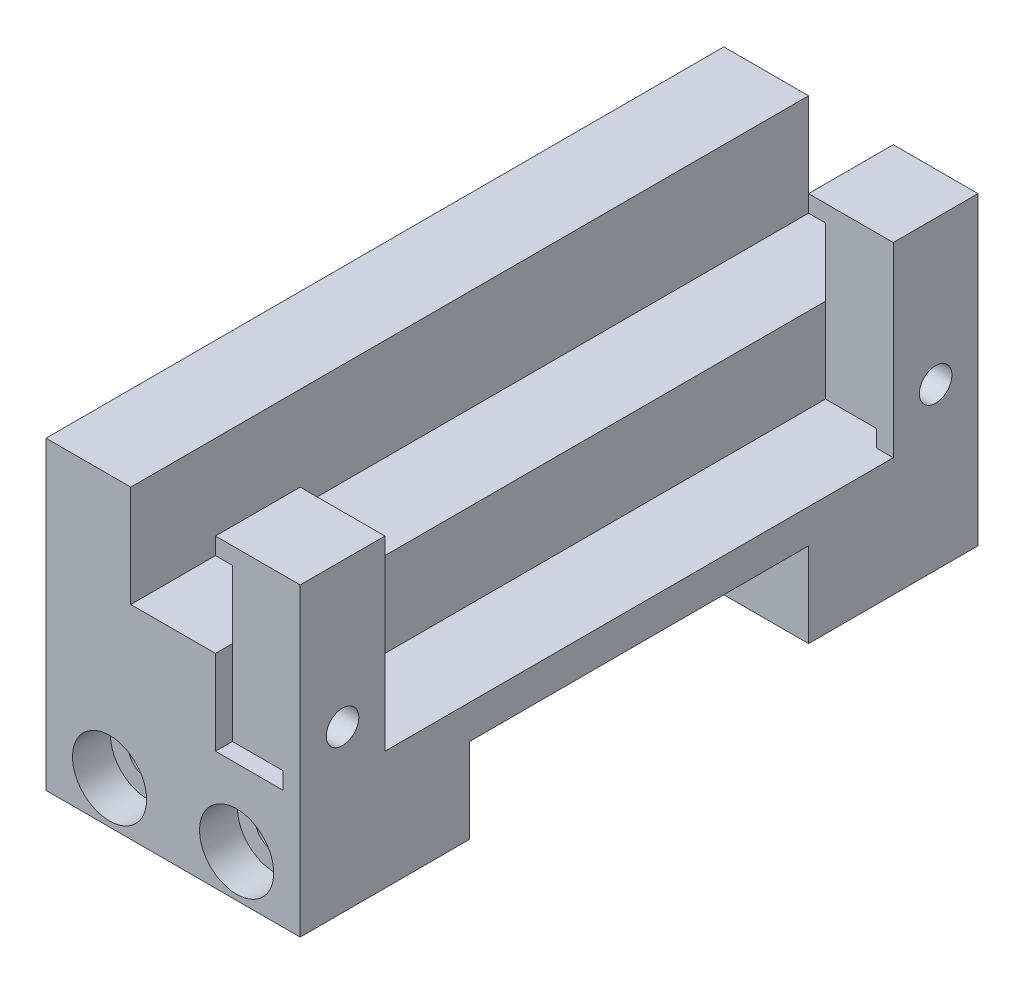
ISO-10303-21;
HEADER;
FILE_DESCRIPTION(('STEP AP214'),'2;1');
FILE_NAME('part.step','',(''),(''),'','','');
FILE_SCHEMA(('AUTOMOTIVE_DESIGN { 1 0 10303 214 1 1 1 1 }'));
ENDSEC;
DATA;
#1=APPLICATION_CONTEXT('core data for automotive mechanical design processes');
#2=APPLICATION_PROTOCOL_DEFINITION('international standard','automotive_design',2000,#1);
#3=PRODUCT_CONTEXT('',#1,'mechanical');
#4=PRODUCT('Part','Part','',(#3));
#5=PRODUCT_RELATED_PRODUCT_CATEGORY('part','',(#4));
#6=PRODUCT_DEFINITION_FORMATION('','',#4);
#7=PRODUCT_DEFINITION_CONTEXT('part definition',#1,'design');
#8=PRODUCT_DEFINITION('design','',#6,#7);
#9=PRODUCT_DEFINITION_SHAPE('','',#8);
#10=(LENGTH_UNIT() NAMED_UNIT(*) SI_UNIT(.MILLI.,.METRE.));
#11=(NAMED_UNIT(*) PLANE_ANGLE_UNIT() SI_UNIT($,.RADIAN.));
#12=(NAMED_UNIT(*) SI_UNIT($,.STERADIAN.) SOLID_ANGLE_UNIT());
#13=UNCERTAINTY_MEASURE_WITH_UNIT(LENGTH_MEASURE(1.E-05),#10,'distance_accuracy_value','');
#14=(GEOMETRIC_REPRESENTATION_CONTEXT(3) GLOBAL_UNCERTAINTY_ASSIGNED_CONTEXT((#13)) GLOBAL_UNIT_ASSIGNED_CONTEXT((#10,
#11,#12)) REPRESENTATION_CONTEXT('',''));
#15=CARTESIAN_POINT('',(0.,0.,0.));
#16=DIRECTION('',(0.,0.,1.));
#17=DIRECTION('',(1.,0.,0.));
#18=AXIS2_PLACEMENT_3D('',#15,#16,#17);
#19=CARTESIAN_POINT('',(9.525,-9.525,25.4));
#20=DIRECTION('',(-1.,0.,0.));
#21=DIRECTION('',(0.,0.,1.));
#22=AXIS2_PLACEMENT_3D('',#19,#20,#21);
#23=PLANE('',#22);
#24=CARTESIAN_POINT('',(9.525,-3.81,22.225));
#25=DIRECTION('',(1.,0.,0.));
#26=DIRECTION('',(0.,0.,-1.));
#27=AXIS2_PLACEMENT_3D('',#24,#25,#26);
#28=CIRCLE('',#27,1.2192);
#29=CARTESIAN_POINT('',(9.525,-3.81,21.0058));
#30=VERTEX_POINT('',#29);
#31=EDGE_CURVE('E495',#30,#30,#28,.T.);
#32=ORIENTED_EDGE('',*,*,#31,.F.);
#33=EDGE_LOOP('',(#32));
#34=FACE_BOUND('',#33,.T.);
#35=DIRECTION('',(0.,0.,1.));
#36=VECTOR('',#35,1.);
#37=CARTESIAN_POINT('',(9.525,6.985,-25.4));
#38=LINE('',#37,#36);
#39=CARTESIAN_POINT('',(9.525,6.985,-25.4));
#40=VERTEX_POINT('',#39);
#41=CARTESIAN_POINT('',(9.525,6.985,-19.05));
#42=VERTEX_POINT('',#41);
#43=EDGE_CURVE('E380',#40,#42,#38,.T.);
#44=ORIENTED_EDGE('',*,*,#43,.T.);
#45=DIRECTION('',(0.,1.,0.));
#46=VECTOR('',#45,1.);
#47=CARTESIAN_POINT('',(9.525,6.985,-19.05));
#48=LINE('',#47,#46);
#49=CARTESIAN_POINT('',(9.525,-6.985,-19.05));
#50=VERTEX_POINT('',#49);
#51=EDGE_CURVE('E254',#50,#42,#48,.T.);
#52=ORIENTED_EDGE('',*,*,#51,.F.);
#53=DIRECTION('',(0.,0.,-1.));
#54=VECTOR('',#53,1.);
#55=CARTESIAN_POINT('',(9.525,-6.985,19.05));
#56=LINE('',#55,#54);
#57=CARTESIAN_POINT('',(9.525,-6.985,19.05));
#58=VERTEX_POINT('',#57);
#59=EDGE_CURVE('E257',#58,#50,#56,.T.);
#60=ORIENTED_EDGE('',*,*,#59,.F.);
#61=DIRECTION('',(0.,-1.,0.));
#62=VECTOR('',#61,1.);
#63=CARTESIAN_POINT('',(9.525,6.985,19.05));
#64=LINE('',#63,#62);
#65=CARTESIAN_POINT('',(9.525,6.985,19.05));
#66=VERTEX_POINT('',#65);
#67=EDGE_CURVE('E251',#66,#58,#64,.T.);
#68=ORIENTED_EDGE('',*,*,#67,.F.);
#69=CARTESIAN_POINT('',(9.525,6.985,25.4));
#70=VERTEX_POINT('',#69);
#71=EDGE_CURVE('E383',#66,#70,#38,.T.);
#72=ORIENTED_EDGE('',*,*,#71,.T.);
#73=DIRECTION('',(0.,1.,0.));
#74=VECTOR('',#73,1.);
#75=CARTESIAN_POINT('',(9.525,-9.525,25.4));
#76=LINE('',#75,#74);
#77=CARTESIAN_POINT('',(9.525,-15.875,25.4));
#78=VERTEX_POINT('',#77);
#79=EDGE_CURVE('E395',#78,#70,#76,.T.);
#80=ORIENTED_EDGE('',*,*,#79,.F.);
#81=DIRECTION('',(0.,0.,1.));
#82=VECTOR('',#81,1.);
#83=CARTESIAN_POINT('',(9.525,-15.875,12.7));
#84=LINE('',#83,#82);
#85=CARTESIAN_POINT('',(9.525,-15.875,12.7));
#86=VERTEX_POINT('',#85);
#87=EDGE_CURVE('E248',#86,#78,#84,.T.);
#88=ORIENTED_EDGE('',*,*,#87,.F.);
#89=DIRECTION('',(0.,1.,0.));
#90=VECTOR('',#89,1.);
#91=CARTESIAN_POINT('',(9.525,-9.525,12.7));
#92=LINE('',#91,#90);
#93=CARTESIAN_POINT('',(9.525,-9.525,12.7));
#94=VERTEX_POINT('',#93);
#95=EDGE_CURVE('E241',#86,#94,#92,.T.);
#96=ORIENTED_EDGE('',*,*,#95,.T.);
#97=DIRECTION('',(0.,0.,-1.));
#98=VECTOR('',#97,1.);
#99=CARTESIAN_POINT('',(9.525,-9.525,25.4));
#100=LINE('',#99,#98);
#101=CARTESIAN_POINT('',(9.525,-9.525,-12.7));
#102=VERTEX_POINT('',#101);
#103=EDGE_CURVE('E41',#94,#102,#100,.T.);
#104=ORIENTED_EDGE('',*,*,#103,.T.);
#105=DIRECTION('',(0.,1.,0.));
#106=VECTOR('',#105,1.);
#107=CARTESIAN_POINT('',(9.525,-9.525,-12.7));
#108=LINE('',#107,#106);
#109=CARTESIAN_POINT('',(9.525,-15.875,-12.7));
#110=VERTEX_POINT('',#109);
#111=EDGE_CURVE('E208',#110,#102,#108,.T.);
#112=ORIENTED_EDGE('',*,*,#111,.F.);
#113=DIRECTION('',(0.,0.,-1.));
#114=VECTOR('',#113,1.);
#115=CARTESIAN_POINT('',(9.525,-15.875,-12.7));
#116=LINE('',#115,#114);
#117=CARTESIAN_POINT('',(9.525,-15.875,-25.4));
#118=VERTEX_POINT('',#117);
#119=EDGE_CURVE('E214',#110,#118,#116,.T.);
#120=ORIENTED_EDGE('',*,*,#119,.T.);
#121=DIRECTION('',(0.,1.,0.));
#122=VECTOR('',#121,1.);
#123=CARTESIAN_POINT('',(9.525,-9.525,-25.4));
#124=LINE('',#123,#122);
#125=EDGE_CURVE('E382',#118,#40,#124,.T.);
#126=ORIENTED_EDGE('',*,*,#125,.T.);
#127=EDGE_LOOP('',(#44,#52,#60,#68,#72,#80,#88,#96,#104,#112,#120,#126));
#128=FACE_BOUND('',#127,.T.);
#129=CARTESIAN_POINT('',(9.525,-3.81,-22.225));
#130=DIRECTION('',(1.,0.,0.));
#131=DIRECTION('',(0.,0.,-1.));
#132=AXIS2_PLACEMENT_3D('',#129,#130,#131);
#133=CIRCLE('',#132,1.2192);
#134=CARTESIAN_POINT('',(9.525,-3.81,-23.4442));
#135=VERTEX_POINT('',#134);
#136=EDGE_CURVE('E489',#135,#135,#133,.T.);
#137=ORIENTED_EDGE('',*,*,#136,.F.);
#138=EDGE_LOOP('',(#137));
#139=FACE_BOUND('',#138,.T.);
#140=ADVANCED_FACE('F34',(#34,#128,#139),#23,.F.);
#141=CARTESIAN_POINT('',(-9.525,-9.525,25.4));
#142=DIRECTION('',(0.,1.,0.));
#143=DIRECTION('',(0.,0.,1.));
#144=AXIS2_PLACEMENT_3D('',#141,#142,#143);
#145=PLANE('',#144);
#146=DIRECTION('',(-1.,0.,0.));
#147=VECTOR('',#146,1.);
#148=CARTESIAN_POINT('',(-9.525,-9.525,-12.7));
#149=LINE('',#148,#147);
#150=CARTESIAN_POINT('',(-9.525,-9.525,-12.7));
#151=VERTEX_POINT('',#150);
#152=EDGE_CURVE('E50',#102,#151,#149,.T.);
#153=ORIENTED_EDGE('',*,*,#152,.F.);
#154=ORIENTED_EDGE('',*,*,#103,.F.);
#155=DIRECTION('',(-1.,0.,0.));
#156=VECTOR('',#155,1.);
#157=CARTESIAN_POINT('',(-9.525,-9.525,12.7));
#158=LINE('',#157,#156);
#159=CARTESIAN_POINT('',(-9.525,-9.525,12.7));
#160=VERTEX_POINT('',#159);
#161=EDGE_CURVE('E243',#94,#160,#158,.T.);
#162=ORIENTED_EDGE('',*,*,#161,.T.);
#163=DIRECTION('',(0.,0.,-1.));
#164=VECTOR('',#163,1.);
#165=CARTESIAN_POINT('',(-9.525,-9.525,25.4));
#166=LINE('',#165,#164);
#167=EDGE_CURVE('E11',#160,#151,#166,.T.);
#168=ORIENTED_EDGE('',*,*,#167,.T.);
#169=EDGE_LOOP('',(#153,#154,#162,#168));
#170=FACE_BOUND('',#169,.T.);
#171=ADVANCED_FACE('F556',(#170),#145,.F.);
#172=CARTESIAN_POINT('',(3.175,0.,-25.4));
#173=DIRECTION('',(-1.,0.,0.));
#174=DIRECTION('',(0.,0.,1.));
#175=AXIS2_PLACEMENT_3D('',#172,#173,#174);
#176=PLANE('',#175);
#177=DIRECTION('',(0.,1.,0.));
#178=VECTOR('',#177,1.);
#179=CARTESIAN_POINT('',(3.175,6.985,-19.05));
#180=LINE('',#179,#178);
#181=CARTESIAN_POINT('',(3.175,5.715,-19.05));
#182=VERTEX_POINT('',#181);
#183=CARTESIAN_POINT('',(3.175,6.985,-19.05));
#184=VERTEX_POINT('',#183);
#185=EDGE_CURVE('E267',#182,#184,#180,.T.);
#186=ORIENTED_EDGE('',*,*,#185,.T.);
#187=DIRECTION('',(0.,0.,1.));
#188=VECTOR('',#187,1.);
#189=CARTESIAN_POINT('',(3.175,6.985,-25.4));
#190=LINE('',#189,#188);
#191=CARTESIAN_POINT('',(3.175,6.985,-25.4));
#192=VERTEX_POINT('',#191);
#193=EDGE_CURVE('E384',#192,#184,#190,.T.);
#194=ORIENTED_EDGE('',*,*,#193,.F.);
#195=DIRECTION('',(0.,-1.,0.));
#196=VECTOR('',#195,1.);
#197=CARTESIAN_POINT('',(3.175,0.,-25.4));
#198=LINE('',#197,#196);
#199=CARTESIAN_POINT('',(3.175,5.715,-25.4));
#200=VERTEX_POINT('',#199);
#201=EDGE_CURVE('E360',#192,#200,#198,.T.);
#202=ORIENTED_EDGE('',*,*,#201,.T.);
#203=DIRECTION('',(0.,0.,1.));
#204=VECTOR('',#203,1.);
#205=CARTESIAN_POINT('',(3.175,5.715,-25.4));
#206=LINE('',#205,#204);
#207=EDGE_CURVE('E328',#200,#182,#206,.T.);
#208=ORIENTED_EDGE('',*,*,#207,.T.);
#209=EDGE_LOOP('',(#186,#194,#202,#208));
#210=FACE_BOUND('',#209,.T.);
#211=ADVANCED_FACE('F419',(#210),#176,.T.);
#212=CARTESIAN_POINT('',(0.,6.985,-25.4));
#213=DIRECTION('',(0.,-1.,0.));
#214=DIRECTION('',(0.,0.,-1.));
#215=AXIS2_PLACEMENT_3D('',#212,#213,#214);
#216=PLANE('',#215);
#217=ORIENTED_EDGE('',*,*,#193,.T.);
#218=DIRECTION('',(1.,0.,0.));
#219=VECTOR('',#218,1.);
#220=CARTESIAN_POINT('',(-37.405425084023,6.985,-19.05));
#221=LINE('',#220,#219);
#222=EDGE_CURVE('E270',#184,#42,#221,.T.);
#223=ORIENTED_EDGE('',*,*,#222,.T.);
#224=ORIENTED_EDGE('',*,*,#43,.F.);
#225=DIRECTION('',(1.,0.,0.));
#226=VECTOR('',#225,1.);
#227=CARTESIAN_POINT('',(0.,6.985,-25.4));
#228=LINE('',#227,#226);
#229=EDGE_CURVE('E363',#192,#40,#228,.T.);
#230=ORIENTED_EDGE('',*,*,#229,.F.);
#231=EDGE_LOOP('',(#217,#223,#224,#230));
#232=FACE_BOUND('',#231,.T.);
#233=ADVANCED_FACE('F414',(#232),#216,.F.);
#234=CARTESIAN_POINT('',(0.,5.715,-25.4));
#235=DIRECTION('',(0.,-1.,0.));
#236=DIRECTION('',(0.,0.,-1.));
#237=AXIS2_PLACEMENT_3D('',#234,#235,#236);
#238=PLANE('',#237);
#239=DIRECTION('',(1.,0.,0.));
#240=VECTOR('',#239,1.);
#241=CARTESIAN_POINT('',(0.,5.715,-19.05));
#242=LINE('',#241,#240);
#243=CARTESIAN_POINT('',(4.445,5.715,-19.05));
#244=VERTEX_POINT('',#243);
#245=EDGE_CURVE('E292',#182,#244,#242,.T.);
#246=ORIENTED_EDGE('',*,*,#245,.F.);
#247=ORIENTED_EDGE('',*,*,#207,.F.);
#248=DIRECTION('',(1.,0.,0.));
#249=VECTOR('',#248,1.);
#250=CARTESIAN_POINT('',(0.,5.715,-25.4));
#251=LINE('',#250,#249);
#252=CARTESIAN_POINT('',(4.445,5.715,-25.4));
#253=VERTEX_POINT('',#252);
#254=EDGE_CURVE('E309',#200,#253,#251,.T.);
#255=ORIENTED_EDGE('',*,*,#254,.T.);
#256=DIRECTION('',(0.,0.,1.));
#257=VECTOR('',#256,1.);
#258=CARTESIAN_POINT('',(4.445,5.715,-25.4));
#259=LINE('',#258,#257);
#260=EDGE_CURVE('E333',#253,#244,#259,.T.);
#261=ORIENTED_EDGE('',*,*,#260,.T.);
#262=EDGE_LOOP('',(#246,#247,#255,#261));
#263=FACE_BOUND('',#262,.T.);
#264=ADVANCED_FACE('F422',(#263),#238,.T.);
#265=CARTESIAN_POINT('',(4.445,0.,-25.4));
#266=DIRECTION('',(-1.,0.,0.));
#267=DIRECTION('',(0.,-1.,0.));
#268=AXIS2_PLACEMENT_3D('',#265,#266,#267);
#269=PLANE('',#268);
#270=CARTESIAN_POINT('',(4.445,-3.81,-22.225));
#271=DIRECTION('',(-1.,0.,0.));
#272=DIRECTION('',(0.,-1.,0.));
#273=AXIS2_PLACEMENT_3D('',#270,#271,#272);
#274=CIRCLE('',#273,1.2192);
#275=CARTESIAN_POINT('',(4.445,-5.0292,-22.225));
#276=VERTEX_POINT('',#275);
#277=EDGE_CURVE('E486',#276,#276,#274,.T.);
#278=ORIENTED_EDGE('',*,*,#277,.F.);
#279=EDGE_LOOP('',(#278));
#280=FACE_BOUND('',#279,.T.);
#281=DIRECTION('',(0.,-1.,0.));
#282=VECTOR('',#281,1.);
#283=CARTESIAN_POINT('',(4.445,0.,-19.05));
#284=LINE('',#283,#282);
#285=CARTESIAN_POINT('',(4.445,-5.715,-19.05));
#286=VERTEX_POINT('',#285);
#287=EDGE_CURVE('E290',#244,#286,#284,.T.);
#288=ORIENTED_EDGE('',*,*,#287,.F.);
#289=ORIENTED_EDGE('',*,*,#260,.F.);
#290=DIRECTION('',(0.,-1.,0.));
#291=VECTOR('',#290,1.);
#292=CARTESIAN_POINT('',(4.445,0.,-25.4));
#293=LINE('',#292,#291);
#294=CARTESIAN_POINT('',(4.445,-5.715,-25.4));
#295=VERTEX_POINT('',#294);
#296=EDGE_CURVE('E307',#253,#295,#293,.T.);
#297=ORIENTED_EDGE('',*,*,#296,.T.);
#298=DIRECTION('',(0.,0.,1.));
#299=VECTOR('',#298,1.);
#300=CARTESIAN_POINT('',(4.445,-5.715,-25.4));
#301=LINE('',#300,#299);
#302=EDGE_CURVE('E337',#295,#286,#301,.T.);
#303=ORIENTED_EDGE('',*,*,#302,.T.);
#304=EDGE_LOOP('',(#288,#289,#297,#303));
#305=FACE_BOUND('',#304,.T.);
#306=ADVANCED_FACE('F429',(#280,#305),#269,.T.);
#307=CARTESIAN_POINT('',(0.,-5.715,-25.4));
#308=DIRECTION('',(0.,-1.,0.));
#309=DIRECTION('',(0.,0.,-1.));
#310=AXIS2_PLACEMENT_3D('',#307,#308,#309);
#311=PLANE('',#310);
#312=DIRECTION('',(1.,0.,0.));
#313=VECTOR('',#312,1.);
#314=CARTESIAN_POINT('',(0.,-5.715,-19.05));
#315=LINE('',#314,#313);
#316=CARTESIAN_POINT('',(8.255,-5.715,-19.05));
#317=VERTEX_POINT('',#316);
#318=EDGE_CURVE('E288',#286,#317,#315,.T.);
#319=ORIENTED_EDGE('',*,*,#318,.F.);
#320=ORIENTED_EDGE('',*,*,#302,.F.);
#321=DIRECTION('',(1.,0.,0.));
#322=VECTOR('',#321,1.);
#323=CARTESIAN_POINT('',(0.,-5.715,-25.4));
#324=LINE('',#323,#322);
#325=CARTESIAN_POINT('',(8.255,-5.715,-25.4));
#326=VERTEX_POINT('',#325);
#327=EDGE_CURVE('E305',#295,#326,#324,.T.);
#328=ORIENTED_EDGE('',*,*,#327,.T.);
#329=DIRECTION('',(0.,0.,1.));
#330=VECTOR('',#329,1.);
#331=CARTESIAN_POINT('',(8.255,-5.715,-25.4));
#332=LINE('',#331,#330);
#333=EDGE_CURVE('E341',#326,#317,#332,.T.);
#334=ORIENTED_EDGE('',*,*,#333,.T.);
#335=EDGE_LOOP('',(#319,#320,#328,#334));
#336=FACE_BOUND('',#335,.T.);
#337=ADVANCED_FACE('F432',(#336),#311,.T.);
#338=CARTESIAN_POINT('',(8.255,0.,-25.4));
#339=DIRECTION('',(1.,0.,0.));
#340=DIRECTION('',(0.,0.,-1.));
#341=AXIS2_PLACEMENT_3D('',#338,#339,#340);
#342=PLANE('',#341);
#343=DIRECTION('',(0.,0.,1.));
#344=VECTOR('',#343,1.);
#345=CARTESIAN_POINT('',(8.255,-6.985,-25.4));
#346=LINE('',#345,#344);
#347=CARTESIAN_POINT('',(8.255,-6.985,-25.4));
#348=VERTEX_POINT('',#347);
#349=CARTESIAN_POINT('',(8.255,-6.985,-19.05));
#350=VERTEX_POINT('',#349);
#351=EDGE_CURVE('E345',#348,#350,#346,.T.);
#352=ORIENTED_EDGE('',*,*,#351,.T.);
#353=DIRECTION('',(0.,1.,0.));
#354=VECTOR('',#353,1.);
#355=CARTESIAN_POINT('',(8.255,0.,-19.05));
#356=LINE('',#355,#354);
#357=EDGE_CURVE('E285',#350,#317,#356,.T.);
#358=ORIENTED_EDGE('',*,*,#357,.T.);
#359=ORIENTED_EDGE('',*,*,#333,.F.);
#360=DIRECTION('',(0.,1.,0.));
#361=VECTOR('',#360,1.);
#362=CARTESIAN_POINT('',(8.255,0.,-25.4));
#363=LINE('',#362,#361);
#364=EDGE_CURVE('E302',#348,#326,#363,.T.);
#365=ORIENTED_EDGE('',*,*,#364,.F.);
#366=EDGE_LOOP('',(#352,#358,#359,#365));
#367=FACE_BOUND('',#366,.T.);
#368=ADVANCED_FACE('F436',(#367),#342,.F.);
#369=DIRECTION('',(0.,-1.,0.));
#370=VECTOR('',#369,1.);
#371=CARTESIAN_POINT('',(3.175,6.985,19.05));
#372=LINE('',#371,#370);
#373=CARTESIAN_POINT('',(3.175,6.985,19.05));
#374=VERTEX_POINT('',#373);
#375=CARTESIAN_POINT('',(3.175,5.715,19.05));
#376=VERTEX_POINT('',#375);
#377=EDGE_CURVE('E262',#374,#376,#372,.T.);
#378=ORIENTED_EDGE('',*,*,#377,.T.);
#379=CARTESIAN_POINT('',(3.175,5.715,25.4));
#380=VERTEX_POINT('',#379);
#381=EDGE_CURVE('E332',#376,#380,#206,.T.);
#382=ORIENTED_EDGE('',*,*,#381,.T.);
#383=DIRECTION('',(0.,-1.,0.));
#384=VECTOR('',#383,1.);
#385=CARTESIAN_POINT('',(3.175,0.,25.4));
#386=LINE('',#385,#384);
#387=CARTESIAN_POINT('',(3.175,6.985,25.4));
#388=VERTEX_POINT('',#387);
#389=EDGE_CURVE('E375',#388,#380,#386,.T.);
#390=ORIENTED_EDGE('',*,*,#389,.F.);
#391=EDGE_CURVE('E387',#374,#388,#190,.T.);
#392=ORIENTED_EDGE('',*,*,#391,.F.);
#393=EDGE_LOOP('',(#378,#382,#390,#392));
#394=FACE_BOUND('',#393,.T.);
#395=ADVANCED_FACE('F544',(#394),#176,.T.);
#396=CARTESIAN_POINT('',(-9.525,-9.525,25.4));
#397=DIRECTION('',(1.,0.,0.));
#398=DIRECTION('',(0.,0.,-1.));
#399=AXIS2_PLACEMENT_3D('',#396,#397,#398);
#400=PLANE('',#399);
#401=CARTESIAN_POINT('',(-9.525,-3.81,22.225));
#402=DIRECTION('',(1.,0.,0.));
#403=DIRECTION('',(0.,0.,-1.));
#404=AXIS2_PLACEMENT_3D('',#401,#402,#403);
#405=CIRCLE('',#404,0.888999999999998);
#406=CARTESIAN_POINT('',(-9.525,-3.81,21.336));
#407=VERTEX_POINT('',#406);
#408=EDGE_CURVE('E504',#407,#407,#405,.T.);
#409=ORIENTED_EDGE('',*,*,#408,.T.);
#410=EDGE_LOOP('',(#409));
#411=FACE_BOUND('',#410,.T.);
#412=CARTESIAN_POINT('',(-9.525,-3.81,-22.225));
#413=DIRECTION('',(1.,0.,0.));
#414=DIRECTION('',(0.,0.,-1.));
#415=AXIS2_PLACEMENT_3D('',#412,#413,#414);
#416=CIRCLE('',#415,0.888999999999998);
#417=CARTESIAN_POINT('',(-9.525,-3.81,-23.114));
#418=VERTEX_POINT('',#417);
#419=EDGE_CURVE('E498',#418,#418,#416,.T.);
#420=ORIENTED_EDGE('',*,*,#419,.T.);
#421=EDGE_LOOP('',(#420));
#422=FACE_BOUND('',#421,.T.);
#423=DIRECTION('',(0.,-1.,0.));
#424=VECTOR('',#423,1.);
#425=CARTESIAN_POINT('',(-9.525,-9.525,25.4));
#426=LINE('',#425,#424);
#427=CARTESIAN_POINT('',(-9.525,6.985,25.4));
#428=VERTEX_POINT('',#427);
#429=CARTESIAN_POINT('',(-9.525,-15.875,25.4));
#430=VERTEX_POINT('',#429);
#431=EDGE_CURVE('E398',#428,#430,#426,.T.);
#432=ORIENTED_EDGE('',*,*,#431,.F.);
#433=DIRECTION('',(0.,0.,1.));
#434=VECTOR('',#433,1.);
#435=CARTESIAN_POINT('',(-9.525,6.985,-25.4));
#436=LINE('',#435,#434);
#437=CARTESIAN_POINT('',(-9.525,6.985,-25.4));
#438=VERTEX_POINT('',#437);
#439=EDGE_CURVE('E366',#438,#428,#436,.T.);
#440=ORIENTED_EDGE('',*,*,#439,.F.);
#441=DIRECTION('',(0.,-1.,0.));
#442=VECTOR('',#441,1.);
#443=CARTESIAN_POINT('',(-9.525,-9.525,-25.4));
#444=LINE('',#443,#442);
#445=CARTESIAN_POINT('',(-9.525,-15.875,-25.4));
#446=VERTEX_POINT('',#445);
#447=EDGE_CURVE('E399',#438,#446,#444,.T.);
#448=ORIENTED_EDGE('',*,*,#447,.T.);
#449=DIRECTION('',(0.,0.,-1.));
#450=VECTOR('',#449,1.);
#451=CARTESIAN_POINT('',(-9.525,-15.875,-12.7));
#452=LINE('',#451,#450);
#453=CARTESIAN_POINT('',(-9.525,-15.875,-12.7));
#454=VERTEX_POINT('',#453);
#455=EDGE_CURVE('E223',#454,#446,#452,.T.);
#456=ORIENTED_EDGE('',*,*,#455,.F.);
#457=DIRECTION('',(0.,-1.,0.));
#458=VECTOR('',#457,1.);
#459=CARTESIAN_POINT('',(-9.525,-9.525,-12.7));
#460=LINE('',#459,#458);
#461=EDGE_CURVE('E210',#151,#454,#460,.T.);
#462=ORIENTED_EDGE('',*,*,#461,.F.);
#463=ORIENTED_EDGE('',*,*,#167,.F.);
#464=DIRECTION('',(0.,-1.,0.));
#465=VECTOR('',#464,1.);
#466=CARTESIAN_POINT('',(-9.525,-9.525,12.7));
#467=LINE('',#466,#465);
#468=CARTESIAN_POINT('',(-9.525,-15.875,12.7));
#469=VERTEX_POINT('',#468);
#470=EDGE_CURVE('E235',#160,#469,#467,.T.);
#471=ORIENTED_EDGE('',*,*,#470,.T.);
#472=DIRECTION('',(0.,0.,1.));
#473=VECTOR('',#472,1.);
#474=CARTESIAN_POINT('',(-9.525,-15.875,12.7));
#475=LINE('',#474,#473);
#476=EDGE_CURVE('E245',#469,#430,#475,.T.);
#477=ORIENTED_EDGE('',*,*,#476,.T.);
#478=EDGE_LOOP('',(#432,#440,#448,#456,#462,#463,#471,#477));
#479=FACE_BOUND('',#478,.T.);
#480=ADVANCED_FACE('F406',(#411,#422,#479),#400,.F.);
#481=CARTESIAN_POINT('',(0.,0.,25.4));
#482=DIRECTION('',(0.,0.,-1.));
#483=DIRECTION('',(-1.,0.,0.));
#484=AXIS2_PLACEMENT_3D('',#481,#482,#483);
#485=PLANE('',#484);
#486=CARTESIAN_POINT('',(-4.7625,-12.7,25.4));
#487=DIRECTION('',(0.,0.,1.));
#488=DIRECTION('',(1.,0.,0.));
#489=AXIS2_PLACEMENT_3D('',#486,#487,#488);
#490=CIRCLE('',#489,2.77876);
#491=CARTESIAN_POINT('',(-1.98374,-12.7,25.4));
#492=VERTEX_POINT('',#491);
#493=EDGE_CURVE('E483',#492,#492,#490,.T.);
#494=ORIENTED_EDGE('',*,*,#493,.F.);
#495=EDGE_LOOP('',(#494));
#496=FACE_BOUND('',#495,.T.);
#497=CARTESIAN_POINT('',(4.7625,-12.7,25.4));
#498=DIRECTION('',(0.,0.,1.));
#499=DIRECTION('',(1.,0.,0.));
#500=AXIS2_PLACEMENT_3D('',#497,#498,#499);
#501=CIRCLE('',#500,2.77876);
#502=CARTESIAN_POINT('',(7.54126,-12.7,25.4));
#503=VERTEX_POINT('',#502);
#504=EDGE_CURVE('E471',#503,#503,#501,.T.);
#505=ORIENTED_EDGE('',*,*,#504,.F.);
#506=EDGE_LOOP('',(#505));
#507=FACE_BOUND('',#506,.T.);
#508=DIRECTION('',(1.,0.,0.));
#509=VECTOR('',#508,1.);
#510=CARTESIAN_POINT('',(0.,-6.985,25.4));
#511=LINE('',#510,#509);
#512=CARTESIAN_POINT('',(3.17500000000001,-6.985,25.4));
#513=VERTEX_POINT('',#512);
#514=CARTESIAN_POINT('',(8.255,-6.985,25.4));
#515=VERTEX_POINT('',#514);
#516=EDGE_CURVE('E314',#513,#515,#511,.T.);
#517=ORIENTED_EDGE('',*,*,#516,.F.);
#518=DIRECTION('',(0.,-1.,0.));
#519=VECTOR('',#518,1.);
#520=CARTESIAN_POINT('',(3.175,0.,25.4));
#521=LINE('',#520,#519);
#522=CARTESIAN_POINT('',(3.175,-0.635,25.4));
#523=VERTEX_POINT('',#522);
#524=EDGE_CURVE('E294',#523,#513,#521,.T.);
#525=ORIENTED_EDGE('',*,*,#524,.F.);
#526=DIRECTION('',(1.,0.,0.));
#527=VECTOR('',#526,1.);
#528=CARTESIAN_POINT('',(0.,-0.635,25.4));
#529=LINE('',#528,#527);
#530=CARTESIAN_POINT('',(-3.175,-0.635,25.4));
#531=VERTEX_POINT('',#530);
#532=EDGE_CURVE('E372',#531,#523,#529,.T.);
#533=ORIENTED_EDGE('',*,*,#532,.F.);
#534=DIRECTION('',(0.,-1.,0.));
#535=VECTOR('',#534,1.);
#536=CARTESIAN_POINT('',(-3.175,0.,25.4));
#537=LINE('',#536,#535);
#538=CARTESIAN_POINT('',(-3.175,6.985,25.4));
#539=VERTEX_POINT('',#538);
#540=EDGE_CURVE('E369',#539,#531,#537,.T.);
#541=ORIENTED_EDGE('',*,*,#540,.F.);
#542=DIRECTION('',(1.,0.,0.));
#543=VECTOR('',#542,1.);
#544=CARTESIAN_POINT('',(0.,6.985,25.4));
#545=LINE('',#544,#543);
#546=EDGE_CURVE('E331',#428,#539,#545,.T.);
#547=ORIENTED_EDGE('',*,*,#546,.F.);
#548=ORIENTED_EDGE('',*,*,#431,.T.);
#549=DIRECTION('',(1.,0.,0.));
#550=VECTOR('',#549,1.);
#551=CARTESIAN_POINT('',(-9.525,-15.875,25.4));
#552=LINE('',#551,#550);
#553=EDGE_CURVE('E233',#430,#78,#552,.T.);
#554=ORIENTED_EDGE('',*,*,#553,.T.);
#555=ORIENTED_EDGE('',*,*,#79,.T.);
#556=DIRECTION('',(1.,0.,0.));
#557=VECTOR('',#556,1.);
#558=CARTESIAN_POINT('',(0.,6.985,25.4));
#559=LINE('',#558,#557);
#560=EDGE_CURVE('E354',#388,#70,#559,.T.);
#561=ORIENTED_EDGE('',*,*,#560,.F.);
#562=ORIENTED_EDGE('',*,*,#389,.T.);
#563=DIRECTION('',(1.,0.,0.));
#564=VECTOR('',#563,1.);
#565=CARTESIAN_POINT('',(0.,5.715,25.4));
#566=LINE('',#565,#564);
#567=CARTESIAN_POINT('',(4.445,5.715,25.4));
#568=VERTEX_POINT('',#567);
#569=EDGE_CURVE('E299',#380,#568,#566,.T.);
#570=ORIENTED_EDGE('',*,*,#569,.T.);
#571=DIRECTION('',(0.,-1.,0.));
#572=VECTOR('',#571,1.);
#573=CARTESIAN_POINT('',(4.445,0.,25.4));
#574=LINE('',#573,#572);
#575=CARTESIAN_POINT('',(4.445,-5.715,25.4));
#576=VERTEX_POINT('',#575);
#577=EDGE_CURVE('E323',#568,#576,#574,.T.);
#578=ORIENTED_EDGE('',*,*,#577,.T.);
#579=DIRECTION('',(1.,0.,0.));
#580=VECTOR('',#579,1.);
#581=CARTESIAN_POINT('',(0.,-5.715,25.4));
#582=LINE('',#581,#580);
#583=CARTESIAN_POINT('',(8.255,-5.715,25.4));
#584=VERTEX_POINT('',#583);
#585=EDGE_CURVE('E320',#576,#584,#582,.T.);
#586=ORIENTED_EDGE('',*,*,#585,.T.);
#587=DIRECTION('',(0.,1.,0.));
#588=VECTOR('',#587,1.);
#589=CARTESIAN_POINT('',(8.255,0.,25.4));
#590=LINE('',#589,#588);
#591=EDGE_CURVE('E317',#515,#584,#590,.T.);
#592=ORIENTED_EDGE('',*,*,#591,.F.);
#593=EDGE_LOOP('',(#517,#525,#533,#541,#547,#548,#554,#555,#561,#562,#570,#578,#586,#592));
#594=FACE_BOUND('',#593,.T.);
#595=ADVANCED_FACE('F453',(#496,#507,#594),#485,.F.);
#596=CARTESIAN_POINT('',(0.,0.,-25.4));
#597=DIRECTION('',(0.,0.,-1.));
#598=DIRECTION('',(-1.,0.,0.));
#599=AXIS2_PLACEMENT_3D('',#596,#597,#598);
#600=PLANE('',#599);
#601=DIRECTION('',(0.,-1.,0.));
#602=VECTOR('',#601,1.);
#603=CARTESIAN_POINT('',(3.175,0.,-25.4));
#604=LINE('',#603,#602);
#605=CARTESIAN_POINT('',(3.175,-0.635,-25.4));
#606=VERTEX_POINT('',#605);
#607=CARTESIAN_POINT('',(3.17500000000001,-6.985,-25.4));
#608=VERTEX_POINT('',#607);
#609=EDGE_CURVE('E295',#606,#608,#604,.T.);
#610=ORIENTED_EDGE('',*,*,#609,.T.);
#611=DIRECTION('',(1.,0.,0.));
#612=VECTOR('',#611,1.);
#613=CARTESIAN_POINT('',(0.,-6.985,-25.4));
#614=LINE('',#613,#612);
#615=EDGE_CURVE('E298',#608,#348,#614,.T.);
#616=ORIENTED_EDGE('',*,*,#615,.T.);
#617=ORIENTED_EDGE('',*,*,#364,.T.);
#618=ORIENTED_EDGE('',*,*,#327,.F.);
#619=ORIENTED_EDGE('',*,*,#296,.F.);
#620=ORIENTED_EDGE('',*,*,#254,.F.);
#621=ORIENTED_EDGE('',*,*,#201,.F.);
#622=ORIENTED_EDGE('',*,*,#229,.T.);
#623=ORIENTED_EDGE('',*,*,#125,.F.);
#624=DIRECTION('',(1.,0.,0.));
#625=VECTOR('',#624,1.);
#626=CARTESIAN_POINT('',(-9.525,-15.875,-25.4));
#627=LINE('',#626,#625);
#628=EDGE_CURVE('E220',#446,#118,#627,.T.);
#629=ORIENTED_EDGE('',*,*,#628,.F.);
#630=ORIENTED_EDGE('',*,*,#447,.F.);
#631=DIRECTION('',(1.,0.,0.));
#632=VECTOR('',#631,1.);
#633=CARTESIAN_POINT('',(0.,6.985,-25.4));
#634=LINE('',#633,#632);
#635=CARTESIAN_POINT('',(-3.175,6.985,-25.4));
#636=VERTEX_POINT('',#635);
#637=EDGE_CURVE('E350',#438,#636,#634,.T.);
#638=ORIENTED_EDGE('',*,*,#637,.T.);
#639=DIRECTION('',(0.,-1.,0.));
#640=VECTOR('',#639,1.);
#641=CARTESIAN_POINT('',(-3.175,0.,-25.4));
#642=LINE('',#641,#640);
#643=CARTESIAN_POINT('',(-3.175,-0.635,-25.4));
#644=VERTEX_POINT('',#643);
#645=EDGE_CURVE('E353',#636,#644,#642,.T.);
#646=ORIENTED_EDGE('',*,*,#645,.T.);
#647=DIRECTION('',(1.,0.,0.));
#648=VECTOR('',#647,1.);
#649=CARTESIAN_POINT('',(0.,-0.635,-25.4));
#650=LINE('',#649,#648);
#651=EDGE_CURVE('E357',#644,#606,#650,.T.);
#652=ORIENTED_EDGE('',*,*,#651,.T.);
#653=EDGE_LOOP('',(#610,#616,#617,#618,#619,#620,#621,#622,#623,#629,#630,#638,#646,#652));
#654=FACE_BOUND('',#653,.T.);
#655=ADVANCED_FACE('F408',(#654),#600,.T.);
#656=ORIENTED_EDGE('',*,*,#71,.F.);
#657=DIRECTION('',(1.,0.,0.));
#658=VECTOR('',#657,1.);
#659=CARTESIAN_POINT('',(-37.405425084023,6.985,19.05));
#660=LINE('',#659,#658);
#661=EDGE_CURVE('E266',#374,#66,#660,.T.);
#662=ORIENTED_EDGE('',*,*,#661,.F.);
#663=ORIENTED_EDGE('',*,*,#391,.T.);
#664=ORIENTED_EDGE('',*,*,#560,.T.);
#665=EDGE_LOOP('',(#656,#662,#663,#664));
#666=FACE_BOUND('',#665,.T.);
#667=ADVANCED_FACE('F447',(#666),#216,.F.);
#668=CARTESIAN_POINT('',(0.,-0.635,-25.4));
#669=DIRECTION('',(0.,-1.,0.));
#670=DIRECTION('',(0.,0.,-1.));
#671=AXIS2_PLACEMENT_3D('',#668,#669,#670);
#672=PLANE('',#671);
#673=ORIENTED_EDGE('',*,*,#532,.T.);
#674=DIRECTION('',(0.,0.,1.));
#675=VECTOR('',#674,1.);
#676=CARTESIAN_POINT('',(3.175,-0.635,-25.4));
#677=LINE('',#676,#675);
#678=EDGE_CURVE('E388',#606,#523,#677,.T.);
#679=ORIENTED_EDGE('',*,*,#678,.F.);
#680=ORIENTED_EDGE('',*,*,#651,.F.);
#681=DIRECTION('',(0.,0.,1.));
#682=VECTOR('',#681,1.);
#683=CARTESIAN_POINT('',(-3.175,-0.635,-25.4));
#684=LINE('',#683,#682);
#685=EDGE_CURVE('E390',#644,#531,#684,.T.);
#686=ORIENTED_EDGE('',*,*,#685,.T.);
#687=EDGE_LOOP('',(#673,#679,#680,#686));
#688=FACE_BOUND('',#687,.T.);
#689=ADVANCED_FACE('F640',(#688),#672,.F.);
#690=CARTESIAN_POINT('',(-3.175,0.,-25.4));
#691=DIRECTION('',(-1.,0.,0.));
#692=DIRECTION('',(0.,-1.,0.));
#693=AXIS2_PLACEMENT_3D('',#690,#691,#692);
#694=PLANE('',#693);
#695=ORIENTED_EDGE('',*,*,#540,.T.);
#696=ORIENTED_EDGE('',*,*,#685,.F.);
#697=ORIENTED_EDGE('',*,*,#645,.F.);
#698=DIRECTION('',(0.,0.,1.));
#699=VECTOR('',#698,1.);
#700=CARTESIAN_POINT('',(-3.175,6.985,-25.4));
#701=LINE('',#700,#699);
#702=EDGE_CURVE('E392',#636,#539,#701,.T.);
#703=ORIENTED_EDGE('',*,*,#702,.T.);
#704=EDGE_LOOP('',(#695,#696,#697,#703));
#705=FACE_BOUND('',#704,.T.);
#706=ADVANCED_FACE('F645',(#705),#694,.F.);
#707=CARTESIAN_POINT('',(0.,6.985,-25.4));
#708=DIRECTION('',(0.,-1.,0.));
#709=DIRECTION('',(0.,0.,-1.));
#710=AXIS2_PLACEMENT_3D('',#707,#708,#709);
#711=PLANE('',#710);
#712=ORIENTED_EDGE('',*,*,#546,.T.);
#713=ORIENTED_EDGE('',*,*,#702,.F.);
#714=ORIENTED_EDGE('',*,*,#637,.F.);
#715=ORIENTED_EDGE('',*,*,#439,.T.);
#716=EDGE_LOOP('',(#712,#713,#714,#715));
#717=FACE_BOUND('',#716,.T.);
#718=ADVANCED_FACE('F517',(#717),#711,.F.);
#719=CARTESIAN_POINT('',(3.175,0.,-25.4));
#720=DIRECTION('',(-1.,0.,0.));
#721=DIRECTION('',(0.,-1.,0.));
#722=AXIS2_PLACEMENT_3D('',#719,#720,#721);
#723=PLANE('',#722);
#724=CARTESIAN_POINT('',(3.17500000000001,-3.81,22.225));
#725=DIRECTION('',(1.,0.,0.));
#726=DIRECTION('',(0.,0.,-1.));
#727=AXIS2_PLACEMENT_3D('',#724,#725,#726);
#728=CIRCLE('',#727,0.888999999999987);
#729=CARTESIAN_POINT('',(3.17500000000001,-3.81,21.336));
#730=VERTEX_POINT('',#729);
#731=EDGE_CURVE('E507',#730,#730,#728,.T.);
#732=ORIENTED_EDGE('',*,*,#731,.F.);
#733=EDGE_LOOP('',(#732));
#734=FACE_BOUND('',#733,.T.);
#735=CARTESIAN_POINT('',(3.17500000000001,-3.81,-22.225));
#736=DIRECTION('',(1.,0.,0.));
#737=DIRECTION('',(0.,0.,-1.));
#738=AXIS2_PLACEMENT_3D('',#735,#736,#737);
#739=CIRCLE('',#738,0.888999999999987);
#740=CARTESIAN_POINT('',(3.17500000000001,-3.81,-23.114));
#741=VERTEX_POINT('',#740);
#742=EDGE_CURVE('E501',#741,#741,#739,.T.);
#743=ORIENTED_EDGE('',*,*,#742,.F.);
#744=EDGE_LOOP('',(#743));
#745=FACE_BOUND('',#744,.T.);
#746=ORIENTED_EDGE('',*,*,#524,.T.);
#747=DIRECTION('',(0.,0.,1.));
#748=VECTOR('',#747,1.);
#749=CARTESIAN_POINT('',(3.17500000000001,-6.985,-25.4));
#750=LINE('',#749,#748);
#751=EDGE_CURVE('E311',#608,#513,#750,.T.);
#752=ORIENTED_EDGE('',*,*,#751,.F.);
#753=ORIENTED_EDGE('',*,*,#609,.F.);
#754=ORIENTED_EDGE('',*,*,#678,.T.);
#755=EDGE_LOOP('',(#746,#752,#753,#754));
#756=FACE_BOUND('',#755,.T.);
#757=ADVANCED_FACE('F513',(#734,#745,#756),#723,.F.);
#758=DIRECTION('',(-1.,0.,0.));
#759=VECTOR('',#758,1.);
#760=CARTESIAN_POINT('',(0.,5.715,19.05));
#761=LINE('',#760,#759);
#762=CARTESIAN_POINT('',(4.445,5.715,19.05));
#763=VERTEX_POINT('',#762);
#764=EDGE_CURVE('E283',#763,#376,#761,.T.);
#765=ORIENTED_EDGE('',*,*,#764,.F.);
#766=EDGE_CURVE('E336',#763,#568,#259,.T.);
#767=ORIENTED_EDGE('',*,*,#766,.T.);
#768=ORIENTED_EDGE('',*,*,#569,.F.);
#769=ORIENTED_EDGE('',*,*,#381,.F.);
#770=EDGE_LOOP('',(#765,#767,#768,#769));
#771=FACE_BOUND('',#770,.T.);
#772=ADVANCED_FACE('F516',(#771),#238,.T.);
#773=CARTESIAN_POINT('',(4.445,-3.81,22.225));
#774=DIRECTION('',(-1.,0.,0.));
#775=DIRECTION('',(0.,-1.,0.));
#776=AXIS2_PLACEMENT_3D('',#773,#774,#775);
#777=CIRCLE('',#776,1.2192);
#778=CARTESIAN_POINT('',(4.445,-5.0292,22.225));
#779=VERTEX_POINT('',#778);
#780=EDGE_CURVE('E492',#779,#779,#777,.T.);
#781=ORIENTED_EDGE('',*,*,#780,.F.);
#782=EDGE_LOOP('',(#781));
#783=FACE_BOUND('',#782,.T.);
#784=DIRECTION('',(0.,1.,0.));
#785=VECTOR('',#784,1.);
#786=CARTESIAN_POINT('',(4.445,0.,19.05));
#787=LINE('',#786,#785);
#788=CARTESIAN_POINT('',(4.445,-5.715,19.05));
#789=VERTEX_POINT('',#788);
#790=EDGE_CURVE('E281',#789,#763,#787,.T.);
#791=ORIENTED_EDGE('',*,*,#790,.F.);
#792=EDGE_CURVE('E340',#789,#576,#301,.T.);
#793=ORIENTED_EDGE('',*,*,#792,.T.);
#794=ORIENTED_EDGE('',*,*,#577,.F.);
#795=ORIENTED_EDGE('',*,*,#766,.F.);
#796=EDGE_LOOP('',(#791,#793,#794,#795));
#797=FACE_BOUND('',#796,.T.);
#798=ADVANCED_FACE('F537',(#783,#797),#269,.T.);
#799=DIRECTION('',(-1.,0.,0.));
#800=VECTOR('',#799,1.);
#801=CARTESIAN_POINT('',(0.,-5.715,19.05));
#802=LINE('',#801,#800);
#803=CARTESIAN_POINT('',(8.255,-5.715,19.05));
#804=VERTEX_POINT('',#803);
#805=EDGE_CURVE('E279',#804,#789,#802,.T.);
#806=ORIENTED_EDGE('',*,*,#805,.F.);
#807=EDGE_CURVE('E344',#804,#584,#332,.T.);
#808=ORIENTED_EDGE('',*,*,#807,.T.);
#809=ORIENTED_EDGE('',*,*,#585,.F.);
#810=ORIENTED_EDGE('',*,*,#792,.F.);
#811=EDGE_LOOP('',(#806,#808,#809,#810));
#812=FACE_BOUND('',#811,.T.);
#813=ADVANCED_FACE('F533',(#812),#311,.T.);
#814=ORIENTED_EDGE('',*,*,#807,.F.);
#815=DIRECTION('',(0.,-1.,0.));
#816=VECTOR('',#815,1.);
#817=CARTESIAN_POINT('',(8.255,0.,19.05));
#818=LINE('',#817,#816);
#819=CARTESIAN_POINT('',(8.255,-6.985,19.05));
#820=VERTEX_POINT('',#819);
#821=EDGE_CURVE('E276',#804,#820,#818,.T.);
#822=ORIENTED_EDGE('',*,*,#821,.T.);
#823=EDGE_CURVE('E348',#820,#515,#346,.T.);
#824=ORIENTED_EDGE('',*,*,#823,.T.);
#825=ORIENTED_EDGE('',*,*,#591,.T.);
#826=EDGE_LOOP('',(#814,#822,#824,#825));
#827=FACE_BOUND('',#826,.T.);
#828=ADVANCED_FACE('F527',(#827),#342,.F.);
#829=CARTESIAN_POINT('',(0.,-6.985,-25.4));
#830=DIRECTION('',(0.,-1.,0.));
#831=DIRECTION('',(0.,0.,-1.));
#832=AXIS2_PLACEMENT_3D('',#829,#830,#831);
#833=PLANE('',#832);
#834=ORIENTED_EDGE('',*,*,#823,.F.);
#835=DIRECTION('',(1.,0.,0.));
#836=VECTOR('',#835,1.);
#837=CARTESIAN_POINT('',(-37.405425084023,-6.985,19.05));
#838=LINE('',#837,#836);
#839=EDGE_CURVE('E265',#820,#58,#838,.T.);
#840=ORIENTED_EDGE('',*,*,#839,.T.);
#841=ORIENTED_EDGE('',*,*,#59,.T.);
#842=DIRECTION('',(1.,0.,0.));
#843=VECTOR('',#842,1.);
#844=CARTESIAN_POINT('',(-37.405425084023,-6.985,-19.05));
#845=LINE('',#844,#843);
#846=EDGE_CURVE('E256',#350,#50,#845,.T.);
#847=ORIENTED_EDGE('',*,*,#846,.F.);
#848=ORIENTED_EDGE('',*,*,#351,.F.);
#849=ORIENTED_EDGE('',*,*,#615,.F.);
#850=ORIENTED_EDGE('',*,*,#751,.T.);
#851=ORIENTED_EDGE('',*,*,#516,.T.);
#852=EDGE_LOOP('',(#834,#840,#841,#847,#848,#849,#850,#851));
#853=FACE_BOUND('',#852,.T.);
#854=ADVANCED_FACE('F441',(#853),#833,.F.);
#855=CARTESIAN_POINT('',(-37.405425084023,6.985,-19.05));
#856=DIRECTION('',(0.,0.,-1.));
#857=DIRECTION('',(0.,1.,0.));
#858=AXIS2_PLACEMENT_3D('',#855,#856,#857);
#859=PLANE('',#858);
#860=ORIENTED_EDGE('',*,*,#245,.T.);
#861=ORIENTED_EDGE('',*,*,#287,.T.);
#862=ORIENTED_EDGE('',*,*,#318,.T.);
#863=ORIENTED_EDGE('',*,*,#357,.F.);
#864=ORIENTED_EDGE('',*,*,#846,.T.);
#865=ORIENTED_EDGE('',*,*,#51,.T.);
#866=ORIENTED_EDGE('',*,*,#222,.F.);
#867=ORIENTED_EDGE('',*,*,#185,.F.);
#868=EDGE_LOOP('',(#860,#861,#862,#863,#864,#865,#866,#867));
#869=FACE_BOUND('',#868,.T.);
#870=ADVANCED_FACE('F416',(#869),#859,.F.);
#871=CARTESIAN_POINT('',(-37.405425084023,6.985,19.05));
#872=DIRECTION('',(0.,0.,1.));
#873=DIRECTION('',(1.,0.,0.));
#874=AXIS2_PLACEMENT_3D('',#871,#872,#873);
#875=PLANE('',#874);
#876=ORIENTED_EDGE('',*,*,#764,.T.);
#877=ORIENTED_EDGE('',*,*,#377,.F.);
#878=ORIENTED_EDGE('',*,*,#661,.T.);
#879=ORIENTED_EDGE('',*,*,#67,.T.);
#880=ORIENTED_EDGE('',*,*,#839,.F.);
#881=ORIENTED_EDGE('',*,*,#821,.F.);
#882=ORIENTED_EDGE('',*,*,#805,.T.);
#883=ORIENTED_EDGE('',*,*,#790,.T.);
#884=EDGE_LOOP('',(#876,#877,#878,#879,#880,#881,#882,#883));
#885=FACE_BOUND('',#884,.T.);
#886=ADVANCED_FACE('F529',(#885),#875,.F.);
#887=CARTESIAN_POINT('',(-9.525,-15.875,12.7));
#888=DIRECTION('',(0.,-1.,0.));
#889=DIRECTION('',(0.,0.,-1.));
#890=AXIS2_PLACEMENT_3D('',#887,#888,#889);
#891=PLANE('',#890);
#892=ORIENTED_EDGE('',*,*,#553,.F.);
#893=ORIENTED_EDGE('',*,*,#476,.F.);
#894=DIRECTION('',(1.,0.,0.));
#895=VECTOR('',#894,1.);
#896=CARTESIAN_POINT('',(-9.525,-15.875,12.7));
#897=LINE('',#896,#895);
#898=EDGE_CURVE('E238',#469,#86,#897,.T.);
#899=ORIENTED_EDGE('',*,*,#898,.T.);
#900=ORIENTED_EDGE('',*,*,#87,.T.);
#901=EDGE_LOOP('',(#892,#893,#899,#900));
#902=FACE_BOUND('',#901,.T.);
#903=ADVANCED_FACE('F457',(#902),#891,.T.);
#904=CARTESIAN_POINT('',(0.,0.,12.7));
#905=DIRECTION('',(0.,0.,1.));
#906=DIRECTION('',(1.,0.,0.));
#907=AXIS2_PLACEMENT_3D('',#904,#905,#906);
#908=PLANE('',#907);
#909=CARTESIAN_POINT('',(-4.7625,-12.7,12.7));
#910=DIRECTION('',(0.,0.,1.));
#911=DIRECTION('',(1.,0.,0.));
#912=AXIS2_PLACEMENT_3D('',#909,#910,#911);
#913=CIRCLE('',#912,1.4732);
#914=CARTESIAN_POINT('',(-3.2893,-12.7,12.7));
#915=VERTEX_POINT('',#914);
#916=EDGE_CURVE('E474',#915,#915,#913,.T.);
#917=ORIENTED_EDGE('',*,*,#916,.T.);
#918=EDGE_LOOP('',(#917));
#919=FACE_BOUND('',#918,.T.);
#920=CARTESIAN_POINT('',(4.7625,-12.7,12.7));
#921=DIRECTION('',(0.,0.,1.));
#922=DIRECTION('',(1.,0.,0.));
#923=AXIS2_PLACEMENT_3D('',#920,#921,#922);
#924=CIRCLE('',#923,1.4732);
#925=CARTESIAN_POINT('',(6.2357,-12.7,12.7));
#926=VERTEX_POINT('',#925);
#927=EDGE_CURVE('E232',#926,#926,#924,.T.);
#928=ORIENTED_EDGE('',*,*,#927,.T.);
#929=EDGE_LOOP('',(#928));
#930=FACE_BOUND('',#929,.T.);
#931=ORIENTED_EDGE('',*,*,#470,.F.);
#932=ORIENTED_EDGE('',*,*,#161,.F.);
#933=ORIENTED_EDGE('',*,*,#95,.F.);
#934=ORIENTED_EDGE('',*,*,#898,.F.);
#935=EDGE_LOOP('',(#931,#932,#933,#934));
#936=FACE_BOUND('',#935,.T.);
#937=ADVANCED_FACE('F460',(#919,#930,#936),#908,.F.);
#938=CARTESIAN_POINT('',(-9.525,-15.875,-12.7));
#939=DIRECTION('',(0.,1.,0.));
#940=DIRECTION('',(0.,0.,1.));
#941=AXIS2_PLACEMENT_3D('',#938,#939,#940);
#942=PLANE('',#941);
#943=ORIENTED_EDGE('',*,*,#628,.T.);
#944=ORIENTED_EDGE('',*,*,#119,.F.);
#945=DIRECTION('',(1.,0.,0.));
#946=VECTOR('',#945,1.);
#947=CARTESIAN_POINT('',(-9.525,-15.875,-12.7));
#948=LINE('',#947,#946);
#949=EDGE_CURVE('E204',#454,#110,#948,.T.);
#950=ORIENTED_EDGE('',*,*,#949,.F.);
#951=ORIENTED_EDGE('',*,*,#455,.T.);
#952=EDGE_LOOP('',(#943,#944,#950,#951));
#953=FACE_BOUND('',#952,.T.);
#954=ADVANCED_FACE('F218',(#953),#942,.F.);
#955=CARTESIAN_POINT('',(0.,0.,-12.7));
#956=DIRECTION('',(0.,0.,-1.));
#957=DIRECTION('',(1.,0.,0.));
#958=AXIS2_PLACEMENT_3D('',#955,#956,#957);
#959=PLANE('',#958);
#960=ORIENTED_EDGE('',*,*,#461,.T.);
#961=ORIENTED_EDGE('',*,*,#949,.T.);
#962=ORIENTED_EDGE('',*,*,#111,.T.);
#963=ORIENTED_EDGE('',*,*,#152,.T.);
#964=EDGE_LOOP('',(#960,#961,#962,#963));
#965=FACE_BOUND('',#964,.T.);
#966=ADVANCED_FACE('F206',(#965),#959,.F.);
#967=CARTESIAN_POINT('',(4.7625,-12.7,25.4));
#968=DIRECTION('',(0.,0.,1.));
#969=DIRECTION('',(1.,0.,0.));
#970=AXIS2_PLACEMENT_3D('',#967,#968,#969);
#971=CYLINDRICAL_SURFACE('',#970,1.4732);
#972=ORIENTED_EDGE('',*,*,#927,.F.);
#973=EDGE_LOOP('',(#972));
#974=FACE_BOUND('',#973,.T.);
#975=CARTESIAN_POINT('',(4.7625,-12.7,22.5552));
#976=DIRECTION('',(0.,0.,1.));
#977=DIRECTION('',(1.,0.,0.));
#978=AXIS2_PLACEMENT_3D('',#975,#976,#977);
#979=CIRCLE('',#978,1.4732);
#980=CARTESIAN_POINT('',(6.2357,-12.7,22.5552));
#981=VERTEX_POINT('',#980);
#982=EDGE_CURVE('E465',#981,#981,#979,.T.);
#983=ORIENTED_EDGE('',*,*,#982,.T.);
#984=EDGE_LOOP('',(#983));
#985=FACE_BOUND('',#984,.T.);
#986=ADVANCED_FACE('F615',(#974,#985),#971,.F.);
#987=CARTESIAN_POINT('',(6.2357,-12.7,22.5552));
#988=DIRECTION('',(0.,0.,-1.));
#989=DIRECTION('',(-1.,0.,0.));
#990=AXIS2_PLACEMENT_3D('',#987,#988,#989);
#991=PLANE('',#990);
#992=ORIENTED_EDGE('',*,*,#982,.F.);
#993=EDGE_LOOP('',(#992));
#994=FACE_BOUND('',#993,.T.);
#995=CARTESIAN_POINT('',(4.7625,-12.7,22.5552));
#996=DIRECTION('',(0.,0.,1.));
#997=DIRECTION('',(1.,0.,0.));
#998=AXIS2_PLACEMENT_3D('',#995,#996,#997);
#999=CIRCLE('',#998,2.77876);
#1000=CARTESIAN_POINT('',(7.54126,-12.7,22.5552));
#1001=VERTEX_POINT('',#1000);
#1002=EDGE_CURVE('E468',#1001,#1001,#999,.T.);
#1003=ORIENTED_EDGE('',*,*,#1002,.T.);
#1004=EDGE_LOOP('',(#1003));
#1005=FACE_BOUND('',#1004,.T.);
#1006=ADVANCED_FACE('F611',(#994,#1005),#991,.F.);
#1007=CARTESIAN_POINT('',(4.7625,-12.7,25.4));
#1008=DIRECTION('',(0.,0.,1.));
#1009=DIRECTION('',(1.,0.,0.));
#1010=AXIS2_PLACEMENT_3D('',#1007,#1008,#1009);
#1011=CYLINDRICAL_SURFACE('',#1010,2.77876);
#1012=ORIENTED_EDGE('',*,*,#1002,.F.);
#1013=EDGE_LOOP('',(#1012));
#1014=FACE_BOUND('',#1013,.T.);
#1015=ORIENTED_EDGE('',*,*,#504,.T.);
#1016=EDGE_LOOP('',(#1015));
#1017=FACE_BOUND('',#1016,.T.);
#1018=ADVANCED_FACE('F607',(#1014,#1017),#1011,.F.);
#1019=CARTESIAN_POINT('',(-4.7625,-12.7,25.4));
#1020=DIRECTION('',(0.,0.,1.));
#1021=DIRECTION('',(1.,0.,0.));
#1022=AXIS2_PLACEMENT_3D('',#1019,#1020,#1021);
#1023=CYLINDRICAL_SURFACE('',#1022,1.4732);
#1024=ORIENTED_EDGE('',*,*,#916,.F.);
#1025=EDGE_LOOP('',(#1024));
#1026=FACE_BOUND('',#1025,.T.);
#1027=CARTESIAN_POINT('',(-4.7625,-12.7,22.5552));
#1028=DIRECTION('',(0.,0.,1.));
#1029=DIRECTION('',(1.,0.,0.));
#1030=AXIS2_PLACEMENT_3D('',#1027,#1028,#1029);
#1031=CIRCLE('',#1030,1.4732);
#1032=CARTESIAN_POINT('',(-3.2893,-12.7,22.5552));
#1033=VERTEX_POINT('',#1032);
#1034=EDGE_CURVE('E477',#1033,#1033,#1031,.T.);
#1035=ORIENTED_EDGE('',*,*,#1034,.T.);
#1036=EDGE_LOOP('',(#1035));
#1037=FACE_BOUND('',#1036,.T.);
#1038=ADVANCED_FACE('F603',(#1026,#1037),#1023,.F.);
#1039=CARTESIAN_POINT('',(-3.2893,-12.7,22.5552));
#1040=DIRECTION('',(0.,0.,-1.));
#1041=DIRECTION('',(-1.,0.,0.));
#1042=AXIS2_PLACEMENT_3D('',#1039,#1040,#1041);
#1043=PLANE('',#1042);
#1044=ORIENTED_EDGE('',*,*,#1034,.F.);
#1045=EDGE_LOOP('',(#1044));
#1046=FACE_BOUND('',#1045,.T.);
#1047=CARTESIAN_POINT('',(-4.7625,-12.7,22.5552));
#1048=DIRECTION('',(0.,0.,1.));
#1049=DIRECTION('',(1.,0.,0.));
#1050=AXIS2_PLACEMENT_3D('',#1047,#1048,#1049);
#1051=CIRCLE('',#1050,2.77876);
#1052=CARTESIAN_POINT('',(-1.98374,-12.7,22.5552));
#1053=VERTEX_POINT('',#1052);
#1054=EDGE_CURVE('E480',#1053,#1053,#1051,.T.);
#1055=ORIENTED_EDGE('',*,*,#1054,.T.);
#1056=EDGE_LOOP('',(#1055));
#1057=FACE_BOUND('',#1056,.T.);
#1058=ADVANCED_FACE('F596',(#1046,#1057),#1043,.F.);
#1059=CARTESIAN_POINT('',(-4.7625,-12.7,25.4));
#1060=DIRECTION('',(0.,0.,1.));
#1061=DIRECTION('',(1.,0.,0.));
#1062=AXIS2_PLACEMENT_3D('',#1059,#1060,#1061);
#1063=CYLINDRICAL_SURFACE('',#1062,2.77876);
#1064=ORIENTED_EDGE('',*,*,#1054,.F.);
#1065=EDGE_LOOP('',(#1064));
#1066=FACE_BOUND('',#1065,.T.);
#1067=ORIENTED_EDGE('',*,*,#493,.T.);
#1068=EDGE_LOOP('',(#1067));
#1069=FACE_BOUND('',#1068,.T.);
#1070=ADVANCED_FACE('F590',(#1066,#1069),#1063,.F.);
#1071=CARTESIAN_POINT('',(9.525,-3.81,-22.225));
#1072=DIRECTION('',(1.,0.,0.));
#1073=DIRECTION('',(0.,0.,-1.));
#1074=AXIS2_PLACEMENT_3D('',#1071,#1072,#1073);
#1075=CYLINDRICAL_SURFACE('',#1074,1.2192);
#1076=ORIENTED_EDGE('',*,*,#136,.T.);
#1077=EDGE_LOOP('',(#1076));
#1078=FACE_BOUND('',#1077,.T.);
#1079=ORIENTED_EDGE('',*,*,#277,.T.);
#1080=EDGE_LOOP('',(#1079));
#1081=FACE_BOUND('',#1080,.T.);
#1082=ADVANCED_FACE('F569',(#1078,#1081),#1075,.F.);
#1083=CARTESIAN_POINT('',(9.525,-3.81,22.225));
#1084=DIRECTION('',(1.,0.,0.));
#1085=DIRECTION('',(0.,0.,-1.));
#1086=AXIS2_PLACEMENT_3D('',#1083,#1084,#1085);
#1087=CYLINDRICAL_SURFACE('',#1086,1.2192);
#1088=ORIENTED_EDGE('',*,*,#31,.T.);
#1089=EDGE_LOOP('',(#1088));
#1090=FACE_BOUND('',#1089,.T.);
#1091=ORIENTED_EDGE('',*,*,#780,.T.);
#1092=EDGE_LOOP('',(#1091));
#1093=FACE_BOUND('',#1092,.T.);
#1094=ADVANCED_FACE('F565',(#1090,#1093),#1087,.F.);
#1095=CARTESIAN_POINT('',(3.175,-3.81,-22.225));
#1096=DIRECTION('',(1.,0.,0.));
#1097=DIRECTION('',(0.,0.,-1.));
#1098=AXIS2_PLACEMENT_3D('',#1095,#1096,#1097);
#1099=CYLINDRICAL_SURFACE('',#1098,0.888999999999992);
#1100=ORIENTED_EDGE('',*,*,#419,.F.);
#1101=EDGE_LOOP('',(#1100));
#1102=FACE_BOUND('',#1101,.T.);
#1103=ORIENTED_EDGE('',*,*,#742,.T.);
#1104=EDGE_LOOP('',(#1103));
#1105=FACE_BOUND('',#1104,.T.);
#1106=ADVANCED_FACE('F568',(#1102,#1105),#1099,.F.);
#1107=CARTESIAN_POINT('',(3.175,-3.81,22.225));
#1108=DIRECTION('',(1.,0.,0.));
#1109=DIRECTION('',(0.,0.,-1.));
#1110=AXIS2_PLACEMENT_3D('',#1107,#1108,#1109);
#1111=CYLINDRICAL_SURFACE('',#1110,0.888999999999992);
#1112=ORIENTED_EDGE('',*,*,#408,.F.);
#1113=EDGE_LOOP('',(#1112));
#1114=FACE_BOUND('',#1113,.T.);
#1115=ORIENTED_EDGE('',*,*,#731,.T.);
#1116=EDGE_LOOP('',(#1115));
#1117=FACE_BOUND('',#1116,.T.);
#1118=ADVANCED_FACE('F511',(#1114,#1117),#1111,.F.);
#1119=CLOSED_SHELL('',(#140,#171,#211,#233,#264,#306,#337,#368,#395,#480,#595,#655,#667,#689,
#706,#718,#757,#772,#798,#813,#828,#854,#870,#886,#903,#937,#954,#966,#986,#1006,#1018,#1038,
#1058,#1070,#1082,#1094,#1106,#1118));
#1120=MANIFOLD_SOLID_BREP('B2',#1119);
#1121=ADVANCED_BREP_SHAPE_REPRESENTATION('',(#18,#1120),#14);
#1122=SHAPE_DEFINITION_REPRESENTATION(#9,#1121);
ENDSEC;
END-ISO-10303-21;
